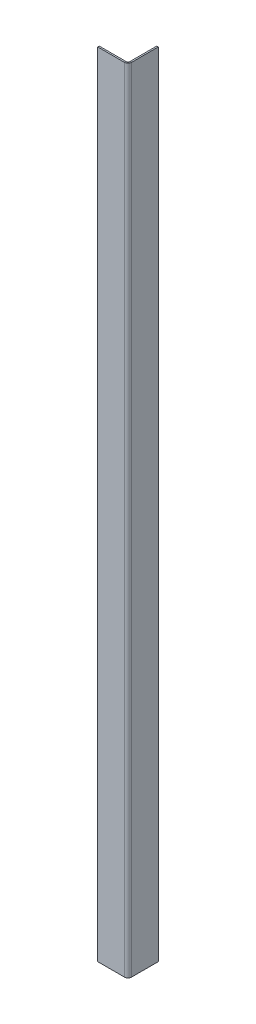
ISO-10303-21;
HEADER;
FILE_DESCRIPTION(('STEP AP214'),'2;1');
FILE_NAME('part.step','',(''),(''),'','','');
FILE_SCHEMA(('AUTOMOTIVE_DESIGN { 1 0 10303 214 1 1 1 1 }'));
ENDSEC;
DATA;
#1=APPLICATION_CONTEXT('core data for automotive mechanical design processes');
#2=APPLICATION_PROTOCOL_DEFINITION('international standard','automotive_design',2000,#1);
#3=PRODUCT_CONTEXT('',#1,'mechanical');
#4=PRODUCT('Part','Part','',(#3));
#5=PRODUCT_RELATED_PRODUCT_CATEGORY('part','',(#4));
#6=PRODUCT_DEFINITION_FORMATION('','',#4);
#7=PRODUCT_DEFINITION_CONTEXT('part definition',#1,'design');
#8=PRODUCT_DEFINITION('design','',#6,#7);
#9=PRODUCT_DEFINITION_SHAPE('','',#8);
#10=(LENGTH_UNIT() NAMED_UNIT(*) SI_UNIT(.MILLI.,.METRE.));
#11=(NAMED_UNIT(*) PLANE_ANGLE_UNIT() SI_UNIT($,.RADIAN.));
#12=(NAMED_UNIT(*) SI_UNIT($,.STERADIAN.) SOLID_ANGLE_UNIT());
#13=UNCERTAINTY_MEASURE_WITH_UNIT(LENGTH_MEASURE(1.E-05),#10,'distance_accuracy_value','');
#14=(GEOMETRIC_REPRESENTATION_CONTEXT(3) GLOBAL_UNCERTAINTY_ASSIGNED_CONTEXT((#13)) GLOBAL_UNIT_ASSIGNED_CONTEXT((#10,
#11,#12)) REPRESENTATION_CONTEXT('',''));
#15=CARTESIAN_POINT('',(0.,0.,0.));
#16=DIRECTION('',(0.,0.,1.));
#17=DIRECTION('',(1.,0.,0.));
#18=AXIS2_PLACEMENT_3D('',#15,#16,#17);
#19=CARTESIAN_POINT('',(-2.,522.5,-20.));
#20=DIRECTION('',(0.,1.,0.));
#21=DIRECTION('',(0.,0.,1.));
#22=AXIS2_PLACEMENT_3D('',#19,#20,#21);
#23=PLANE('',#22);
#24=DIRECTION('',(0.,0.,1.));
#25=VECTOR('',#24,1.);
#26=CARTESIAN_POINT('',(-2.,522.5,-20.));
#27=LINE('',#26,#25);
#28=CARTESIAN_POINT('',(-2.,522.5,-20.));
#29=VERTEX_POINT('',#28);
#30=CARTESIAN_POINT('',(-1.99999999999998,522.5,15.5));
#31=VERTEX_POINT('',#30);
#32=EDGE_CURVE('E113',#29,#31,#27,.T.);
#33=ORIENTED_EDGE('',*,*,#32,.T.);
#34=DIRECTION('',(1.,0.,0.));
#35=VECTOR('',#34,1.);
#36=CARTESIAN_POINT('',(-1.99999999999998,522.5,15.5));
#37=LINE('',#36,#35);
#38=CARTESIAN_POINT('',(0.,522.5,15.5));
#39=VERTEX_POINT('',#38);
#40=EDGE_CURVE('E106',#31,#39,#37,.T.);
#41=ORIENTED_EDGE('',*,*,#40,.T.);
#42=DIRECTION('',(0.,0.,1.));
#43=VECTOR('',#42,1.);
#44=CARTESIAN_POINT('',(0.,522.5,-20.));
#45=LINE('',#44,#43);
#46=CARTESIAN_POINT('',(0.,522.5,-20.));
#47=VERTEX_POINT('',#46);
#48=EDGE_CURVE('E99',#47,#39,#45,.T.);
#49=ORIENTED_EDGE('',*,*,#48,.F.);
#50=DIRECTION('',(1.,0.,0.));
#51=VECTOR('',#50,1.);
#52=CARTESIAN_POINT('',(-2.,522.5,-20.));
#53=LINE('',#52,#51);
#54=EDGE_CURVE('E13',#29,#47,#53,.T.);
#55=ORIENTED_EDGE('',*,*,#54,.F.);
#56=EDGE_LOOP('',(#33,#41,#49,#55));
#57=FACE_BOUND('',#56,.T.);
#58=ADVANCED_FACE('F54',(#57),#23,.T.);
#59=CARTESIAN_POINT('',(-2.,0.,0.));
#60=DIRECTION('',(1.,0.,0.));
#61=DIRECTION('',(0.,0.,-1.));
#62=AXIS2_PLACEMENT_3D('',#59,#60,#61);
#63=PLANE('',#62);
#64=DIRECTION('',(0.,1.,0.));
#65=VECTOR('',#64,1.);
#66=CARTESIAN_POINT('',(-1.99999999999998,522.5,15.5));
#67=LINE('',#66,#65);
#68=CARTESIAN_POINT('',(-1.99999999999998,-522.5,15.5));
#69=VERTEX_POINT('',#68);
#70=EDGE_CURVE('E121',#31,#69,#67,.F.);
#71=ORIENTED_EDGE('',*,*,#70,.F.);
#72=ORIENTED_EDGE('',*,*,#32,.F.);
#73=DIRECTION('',(0.,1.,0.));
#74=VECTOR('',#73,1.);
#75=CARTESIAN_POINT('',(-2.,-522.5,-20.));
#76=LINE('',#75,#74);
#77=CARTESIAN_POINT('',(-2.,-522.5,-20.));
#78=VERTEX_POINT('',#77);
#79=EDGE_CURVE('E93',#78,#29,#76,.T.);
#80=ORIENTED_EDGE('',*,*,#79,.F.);
#81=DIRECTION('',(0.,0.,-1.));
#82=VECTOR('',#81,1.);
#83=CARTESIAN_POINT('',(-2.,-522.5,-20.));
#84=LINE('',#83,#82);
#85=EDGE_CURVE('E107',#69,#78,#84,.T.);
#86=ORIENTED_EDGE('',*,*,#85,.F.);
#87=EDGE_LOOP('',(#71,#72,#80,#86));
#88=FACE_BOUND('',#87,.T.);
#89=ADVANCED_FACE('F222',(#88),#63,.F.);
#90=CARTESIAN_POINT('',(0.,0.,0.));
#91=DIRECTION('',(1.,0.,0.));
#92=DIRECTION('',(0.,0.,-1.));
#93=AXIS2_PLACEMENT_3D('',#90,#91,#92);
#94=PLANE('',#93);
#95=ORIENTED_EDGE('',*,*,#48,.T.);
#96=DIRECTION('',(0.,1.,0.));
#97=VECTOR('',#96,1.);
#98=CARTESIAN_POINT('',(0.,522.5,15.5));
#99=LINE('',#98,#97);
#100=CARTESIAN_POINT('',(0.,-522.5,15.5));
#101=VERTEX_POINT('',#100);
#102=EDGE_CURVE('E131',#39,#101,#99,.F.);
#103=ORIENTED_EDGE('',*,*,#102,.T.);
#104=DIRECTION('',(0.,0.,-1.));
#105=VECTOR('',#104,1.);
#106=CARTESIAN_POINT('',(0.,-522.5,-20.));
#107=LINE('',#106,#105);
#108=CARTESIAN_POINT('',(0.,-522.5,-20.));
#109=VERTEX_POINT('',#108);
#110=EDGE_CURVE('E101',#101,#109,#107,.T.);
#111=ORIENTED_EDGE('',*,*,#110,.T.);
#112=DIRECTION('',(0.,1.,0.));
#113=VECTOR('',#112,1.);
#114=CARTESIAN_POINT('',(0.,-522.5,-20.));
#115=LINE('',#114,#113);
#116=EDGE_CURVE('E91',#109,#47,#115,.T.);
#117=ORIENTED_EDGE('',*,*,#116,.T.);
#118=EDGE_LOOP('',(#95,#103,#111,#117));
#119=FACE_BOUND('',#118,.T.);
#120=ADVANCED_FACE('F97',(#119),#94,.T.);
#121=CARTESIAN_POINT('',(-2.,-522.5,-20.));
#122=DIRECTION('',(0.,0.,-1.));
#123=DIRECTION('',(-1.,0.,0.));
#124=AXIS2_PLACEMENT_3D('',#121,#122,#123);
#125=PLANE('',#124);
#126=ORIENTED_EDGE('',*,*,#116,.F.);
#127=DIRECTION('',(1.,0.,0.));
#128=VECTOR('',#127,1.);
#129=CARTESIAN_POINT('',(-2.,-522.5,-20.));
#130=LINE('',#129,#128);
#131=EDGE_CURVE('E58',#78,#109,#130,.T.);
#132=ORIENTED_EDGE('',*,*,#131,.F.);
#133=ORIENTED_EDGE('',*,*,#79,.T.);
#134=ORIENTED_EDGE('',*,*,#54,.T.);
#135=EDGE_LOOP('',(#126,#132,#133,#134));
#136=FACE_BOUND('',#135,.T.);
#137=ADVANCED_FACE('F89',(#136),#125,.T.);
#138=CARTESIAN_POINT('',(-2.,-522.5,-20.));
#139=DIRECTION('',(0.,-1.,0.));
#140=DIRECTION('',(0.,0.,-1.));
#141=AXIS2_PLACEMENT_3D('',#138,#139,#140);
#142=PLANE('',#141);
#143=DIRECTION('',(1.,0.,0.));
#144=VECTOR('',#143,1.);
#145=CARTESIAN_POINT('',(-1.99999999999998,-522.5,15.5));
#146=LINE('',#145,#144);
#147=EDGE_CURVE('E112',#69,#101,#146,.T.);
#148=ORIENTED_EDGE('',*,*,#147,.F.);
#149=ORIENTED_EDGE('',*,*,#85,.T.);
#150=ORIENTED_EDGE('',*,*,#131,.T.);
#151=ORIENTED_EDGE('',*,*,#110,.F.);
#152=EDGE_LOOP('',(#148,#149,#150,#151));
#153=FACE_BOUND('',#152,.T.);
#154=ADVANCED_FACE('F56',(#153),#142,.T.);
#155=CARTESIAN_POINT('',(-4.49999999999998,-522.5,15.5));
#156=DIRECTION('',(0.,-1.,0.));
#157=DIRECTION('',(0.,0.,-1.));
#158=AXIS2_PLACEMENT_3D('',#155,#156,#157);
#159=PLANE('',#158);
#160=DIRECTION('',(0.,0.,1.));
#161=VECTOR('',#160,1.);
#162=CARTESIAN_POINT('',(-4.49999999999999,-522.5,20.0000000000001));
#163=LINE('',#162,#161);
#164=CARTESIAN_POINT('',(-4.49999999999997,-522.5,18.));
#165=VERTEX_POINT('',#164);
#166=CARTESIAN_POINT('',(-4.49999999999997,-522.5,20.));
#167=VERTEX_POINT('',#166);
#168=EDGE_CURVE('E134',#165,#167,#163,.T.);
#169=ORIENTED_EDGE('',*,*,#168,.F.);
#170=CARTESIAN_POINT('',(-4.49999999999998,-522.5,15.5));
#171=DIRECTION('',(0.,1.,0.));
#172=DIRECTION('',(0.,0.,1.));
#173=AXIS2_PLACEMENT_3D('',#170,#171,#172);
#174=CIRCLE('',#173,2.5);
#175=EDGE_CURVE('E125',#69,#165,#174,.F.);
#176=ORIENTED_EDGE('',*,*,#175,.F.);
#177=ORIENTED_EDGE('',*,*,#147,.T.);
#178=CARTESIAN_POINT('',(-4.49999999999998,-522.5,15.5));
#179=DIRECTION('',(0.,1.,0.));
#180=DIRECTION('',(0.,0.,1.));
#181=AXIS2_PLACEMENT_3D('',#178,#179,#180);
#182=CIRCLE('',#181,4.5);
#183=EDGE_CURVE('E69',#101,#167,#182,.F.);
#184=ORIENTED_EDGE('',*,*,#183,.T.);
#185=EDGE_LOOP('',(#169,#176,#177,#184));
#186=FACE_BOUND('',#185,.T.);
#187=ADVANCED_FACE('F206',(#186),#159,.T.);
#188=CARTESIAN_POINT('',(-4.49999999999998,522.5,15.5));
#189=DIRECTION('',(0.,-1.,0.));
#190=DIRECTION('',(0.,0.,-1.));
#191=AXIS2_PLACEMENT_3D('',#188,#189,#190);
#192=PLANE('',#191);
#193=CARTESIAN_POINT('',(-4.49999999999998,522.5,15.5));
#194=DIRECTION('',(0.,1.,0.));
#195=DIRECTION('',(0.,0.,1.));
#196=AXIS2_PLACEMENT_3D('',#193,#194,#195);
#197=CIRCLE('',#196,2.5);
#198=CARTESIAN_POINT('',(-4.49999999999997,522.5,18.));
#199=VERTEX_POINT('',#198);
#200=EDGE_CURVE('E118',#199,#31,#197,.T.);
#201=ORIENTED_EDGE('',*,*,#200,.F.);
#202=DIRECTION('',(0.,0.,1.));
#203=VECTOR('',#202,1.);
#204=CARTESIAN_POINT('',(-4.49999999999998,522.5,18.));
#205=LINE('',#204,#203);
#206=CARTESIAN_POINT('',(-4.49999999999998,522.5,20.));
#207=VERTEX_POINT('',#206);
#208=EDGE_CURVE('E140',#199,#207,#205,.T.);
#209=ORIENTED_EDGE('',*,*,#208,.T.);
#210=CARTESIAN_POINT('',(-4.49999999999998,522.5,15.5));
#211=DIRECTION('',(0.,1.,0.));
#212=DIRECTION('',(0.,0.,1.));
#213=AXIS2_PLACEMENT_3D('',#210,#211,#212);
#214=CIRCLE('',#213,4.5);
#215=EDGE_CURVE('E128',#207,#39,#214,.T.);
#216=ORIENTED_EDGE('',*,*,#215,.T.);
#217=ORIENTED_EDGE('',*,*,#40,.F.);
#218=EDGE_LOOP('',(#201,#209,#216,#217));
#219=FACE_BOUND('',#218,.T.);
#220=ADVANCED_FACE('F194',(#219),#192,.F.);
#221=CARTESIAN_POINT('',(-4.49999999999998,522.5,15.5));
#222=DIRECTION('',(0.,1.,0.));
#223=DIRECTION('',(0.,0.,1.));
#224=AXIS2_PLACEMENT_3D('',#221,#222,#223);
#225=CYLINDRICAL_SURFACE('',#224,4.5);
#226=ORIENTED_EDGE('',*,*,#102,.F.);
#227=ORIENTED_EDGE('',*,*,#215,.F.);
#228=DIRECTION('',(0.,1.,0.));
#229=VECTOR('',#228,1.);
#230=CARTESIAN_POINT('',(-4.49999999999998,0.,20.));
#231=LINE('',#230,#229);
#232=EDGE_CURVE('E143',#167,#207,#231,.T.);
#233=ORIENTED_EDGE('',*,*,#232,.F.);
#234=ORIENTED_EDGE('',*,*,#183,.F.);
#235=EDGE_LOOP('',(#226,#227,#233,#234));
#236=FACE_BOUND('',#235,.T.);
#237=ADVANCED_FACE('F201',(#236),#225,.T.);
#238=CARTESIAN_POINT('',(-4.49999999999998,522.5,15.5));
#239=DIRECTION('',(0.,1.,0.));
#240=DIRECTION('',(0.,0.,1.));
#241=AXIS2_PLACEMENT_3D('',#238,#239,#240);
#242=CYLINDRICAL_SURFACE('',#241,2.5);
#243=ORIENTED_EDGE('',*,*,#70,.T.);
#244=ORIENTED_EDGE('',*,*,#175,.T.);
#245=DIRECTION('',(0.,-1.,0.));
#246=VECTOR('',#245,1.);
#247=CARTESIAN_POINT('',(-4.49999999999999,-522.5,18.));
#248=LINE('',#247,#246);
#249=EDGE_CURVE('E137',#165,#199,#248,.F.);
#250=ORIENTED_EDGE('',*,*,#249,.T.);
#251=ORIENTED_EDGE('',*,*,#200,.T.);
#252=EDGE_LOOP('',(#243,#244,#250,#251));
#253=FACE_BOUND('',#252,.T.);
#254=ADVANCED_FACE('F224',(#253),#242,.F.);
#255=CARTESIAN_POINT('',(-1.99999999999999,522.5,20.));
#256=DIRECTION('',(0.,1.,0.));
#257=DIRECTION('',(0.,0.,1.));
#258=AXIS2_PLACEMENT_3D('',#255,#256,#257);
#259=PLANE('',#258);
#260=DIRECTION('',(1.,0.,0.));
#261=VECTOR('',#260,1.);
#262=CARTESIAN_POINT('',(-1.99999999999999,522.5,20.));
#263=LINE('',#262,#261);
#264=CARTESIAN_POINT('',(-40.,522.5,20.0000000000001));
#265=VERTEX_POINT('',#264);
#266=EDGE_CURVE('E161',#265,#207,#263,.T.);
#267=ORIENTED_EDGE('',*,*,#266,.T.);
#268=ORIENTED_EDGE('',*,*,#208,.F.);
#269=DIRECTION('',(-1.,0.,0.));
#270=VECTOR('',#269,1.);
#271=CARTESIAN_POINT('',(0.,522.5,18.));
#272=LINE('',#271,#270);
#273=CARTESIAN_POINT('',(-40.,522.5,18.0000000000001));
#274=VERTEX_POINT('',#273);
#275=EDGE_CURVE('E152',#274,#199,#272,.F.);
#276=ORIENTED_EDGE('',*,*,#275,.F.);
#277=DIRECTION('',(0.,0.,-1.));
#278=VECTOR('',#277,1.);
#279=CARTESIAN_POINT('',(-40.,522.5,20.0000000000001));
#280=LINE('',#279,#278);
#281=EDGE_CURVE('E122',#265,#274,#280,.T.);
#282=ORIENTED_EDGE('',*,*,#281,.F.);
#283=EDGE_LOOP('',(#267,#268,#276,#282));
#284=FACE_BOUND('',#283,.T.);
#285=ADVANCED_FACE('F188',(#284),#259,.T.);
#286=CARTESIAN_POINT('',(-40.,-522.5,20.0000000000001));
#287=DIRECTION('',(0.,-1.,0.));
#288=DIRECTION('',(0.,0.,-1.));
#289=AXIS2_PLACEMENT_3D('',#286,#287,#288);
#290=PLANE('',#289);
#291=DIRECTION('',(1.,0.,0.));
#292=VECTOR('',#291,1.);
#293=CARTESIAN_POINT('',(0.,-522.5,18.));
#294=LINE('',#293,#292);
#295=CARTESIAN_POINT('',(-40.,-522.5,18.0000000000001));
#296=VERTEX_POINT('',#295);
#297=EDGE_CURVE('E146',#165,#296,#294,.F.);
#298=ORIENTED_EDGE('',*,*,#297,.F.);
#299=ORIENTED_EDGE('',*,*,#168,.T.);
#300=DIRECTION('',(-1.,0.,0.));
#301=VECTOR('',#300,1.);
#302=CARTESIAN_POINT('',(-40.,-522.5,20.0000000000001));
#303=LINE('',#302,#301);
#304=CARTESIAN_POINT('',(-40.,-522.5,20.0000000000001));
#305=VERTEX_POINT('',#304);
#306=EDGE_CURVE('E155',#167,#305,#303,.T.);
#307=ORIENTED_EDGE('',*,*,#306,.T.);
#308=DIRECTION('',(0.,0.,-1.));
#309=VECTOR('',#308,1.);
#310=CARTESIAN_POINT('',(-40.,-522.5,20.0000000000001));
#311=LINE('',#310,#309);
#312=EDGE_CURVE('E164',#305,#296,#311,.T.);
#313=ORIENTED_EDGE('',*,*,#312,.T.);
#314=EDGE_LOOP('',(#298,#299,#307,#313));
#315=FACE_BOUND('',#314,.T.);
#316=ADVANCED_FACE('F210',(#315),#290,.T.);
#317=CARTESIAN_POINT('',(0.,0.,20.));
#318=DIRECTION('',(0.,0.,1.));
#319=DIRECTION('',(1.,0.,0.));
#320=AXIS2_PLACEMENT_3D('',#317,#318,#319);
#321=PLANE('',#320);
#322=ORIENTED_EDGE('',*,*,#306,.F.);
#323=ORIENTED_EDGE('',*,*,#232,.T.);
#324=ORIENTED_EDGE('',*,*,#266,.F.);
#325=DIRECTION('',(0.,1.,0.));
#326=VECTOR('',#325,1.);
#327=CARTESIAN_POINT('',(-40.,522.5,20.0000000000001));
#328=LINE('',#327,#326);
#329=EDGE_CURVE('E158',#305,#265,#328,.T.);
#330=ORIENTED_EDGE('',*,*,#329,.F.);
#331=EDGE_LOOP('',(#322,#323,#324,#330));
#332=FACE_BOUND('',#331,.T.);
#333=ADVANCED_FACE('F199',(#332),#321,.T.);
#334=CARTESIAN_POINT('',(0.,0.,18.));
#335=DIRECTION('',(0.,0.,1.));
#336=DIRECTION('',(1.,0.,0.));
#337=AXIS2_PLACEMENT_3D('',#334,#335,#336);
#338=PLANE('',#337);
#339=ORIENTED_EDGE('',*,*,#249,.F.);
#340=ORIENTED_EDGE('',*,*,#297,.T.);
#341=DIRECTION('',(0.,-1.,0.));
#342=VECTOR('',#341,1.);
#343=CARTESIAN_POINT('',(-40.,0.,18.0000000000001));
#344=LINE('',#343,#342);
#345=EDGE_CURVE('E149',#296,#274,#344,.F.);
#346=ORIENTED_EDGE('',*,*,#345,.T.);
#347=ORIENTED_EDGE('',*,*,#275,.T.);
#348=EDGE_LOOP('',(#339,#340,#346,#347));
#349=FACE_BOUND('',#348,.T.);
#350=ADVANCED_FACE('F184',(#349),#338,.F.);
#351=CARTESIAN_POINT('',(-40.,522.5,20.0000000000001));
#352=DIRECTION('',(-1.,0.,0.));
#353=DIRECTION('',(0.,0.,1.));
#354=AXIS2_PLACEMENT_3D('',#351,#352,#353);
#355=PLANE('',#354);
#356=ORIENTED_EDGE('',*,*,#345,.F.);
#357=ORIENTED_EDGE('',*,*,#312,.F.);
#358=ORIENTED_EDGE('',*,*,#329,.T.);
#359=ORIENTED_EDGE('',*,*,#281,.T.);
#360=EDGE_LOOP('',(#356,#357,#358,#359));
#361=FACE_BOUND('',#360,.T.);
#362=ADVANCED_FACE('F172',(#361),#355,.T.);
#363=CLOSED_SHELL('',(#58,#89,#120,#137,#154,#187,#220,#237,#254,#285,#316,#333,#350,#362));
#364=MANIFOLD_SOLID_BREP('B2',#363);
#365=ADVANCED_BREP_SHAPE_REPRESENTATION('',(#18,#364),#14);
#366=SHAPE_DEFINITION_REPRESENTATION(#9,#365);
ENDSEC;
END-ISO-10303-21;
